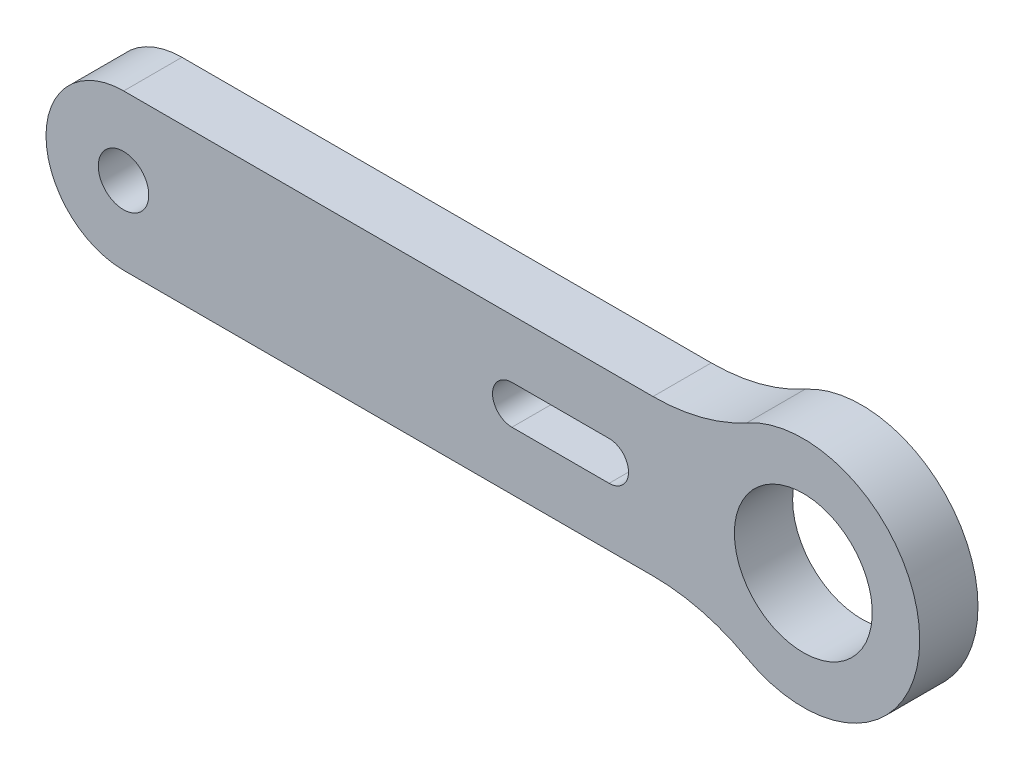
ISO-10303-21;
HEADER;
FILE_DESCRIPTION(('STEP AP214'),'2;1');
FILE_NAME('part.step','',(''),(''),'','','');
FILE_SCHEMA(('AUTOMOTIVE_DESIGN { 1 0 10303 214 1 1 1 1 }'));
ENDSEC;
DATA;
#1=APPLICATION_CONTEXT('core data for automotive mechanical design processes');
#2=APPLICATION_PROTOCOL_DEFINITION('international standard','automotive_design',2000,#1);
#3=PRODUCT_CONTEXT('',#1,'mechanical');
#4=PRODUCT('Part','Part','',(#3));
#5=PRODUCT_RELATED_PRODUCT_CATEGORY('part','',(#4));
#6=PRODUCT_DEFINITION_FORMATION('','',#4);
#7=PRODUCT_DEFINITION_CONTEXT('part definition',#1,'design');
#8=PRODUCT_DEFINITION('design','',#6,#7);
#9=PRODUCT_DEFINITION_SHAPE('','',#8);
#10=(LENGTH_UNIT() NAMED_UNIT(*) SI_UNIT(.MILLI.,.METRE.));
#11=(NAMED_UNIT(*) PLANE_ANGLE_UNIT() SI_UNIT($,.RADIAN.));
#12=(NAMED_UNIT(*) SI_UNIT($,.STERADIAN.) SOLID_ANGLE_UNIT());
#13=UNCERTAINTY_MEASURE_WITH_UNIT(LENGTH_MEASURE(1.E-05),#10,'distance_accuracy_value','');
#14=(GEOMETRIC_REPRESENTATION_CONTEXT(3) GLOBAL_UNCERTAINTY_ASSIGNED_CONTEXT((#13)) GLOBAL_UNIT_ASSIGNED_CONTEXT((#10,
#11,#12)) REPRESENTATION_CONTEXT('',''));
#15=CARTESIAN_POINT('',(0.,0.,0.));
#16=DIRECTION('',(0.,0.,1.));
#17=DIRECTION('',(1.,0.,0.));
#18=AXIS2_PLACEMENT_3D('',#15,#16,#17);
#19=CARTESIAN_POINT('',(23.3783422515076,4.00149259352111,0.));
#20=DIRECTION('',(0.,0.,1.));
#21=DIRECTION('',(1.,0.,0.));
#22=AXIS2_PLACEMENT_3D('',#19,#20,#21);
#23=CYLINDRICAL_SURFACE('',#22,5.99460570350379);
#24=CARTESIAN_POINT('',(23.3783422515076,4.00149259352111,3.));
#25=DIRECTION('',(0.,0.,1.));
#26=DIRECTION('',(1.,0.,0.));
#27=AXIS2_PLACEMENT_3D('',#24,#25,#26);
#28=CIRCLE('',#27,5.99460570350379);
#29=CARTESIAN_POINT('',(20.4804285975604,-1.24611581362462,3.));
#30=VERTEX_POINT('',#29);
#31=CARTESIAN_POINT('',(20.4784035436222,9.24798218476098,3.));
#32=VERTEX_POINT('',#31);
#33=EDGE_CURVE('E160',#30,#32,#28,.T.);
#34=ORIENTED_EDGE('',*,*,#33,.F.);
#35=DIRECTION('',(0.,0.,1.));
#36=VECTOR('',#35,1.);
#37=CARTESIAN_POINT('',(20.4804285975604,-1.24611581362462,0.));
#38=LINE('',#37,#36);
#39=CARTESIAN_POINT('',(20.4804285975604,-1.24611581362462,0.));
#40=VERTEX_POINT('',#39);
#41=EDGE_CURVE('E11',#40,#30,#38,.T.);
#42=ORIENTED_EDGE('',*,*,#41,.F.);
#43=CARTESIAN_POINT('',(23.3783422515076,4.00149259352111,0.));
#44=DIRECTION('',(0.,0.,1.));
#45=DIRECTION('',(1.,0.,0.));
#46=AXIS2_PLACEMENT_3D('',#43,#44,#45);
#47=CIRCLE('',#46,5.99460570350379);
#48=CARTESIAN_POINT('',(20.4784035436222,9.24798218476098,0.));
#49=VERTEX_POINT('',#48);
#50=EDGE_CURVE('E163',#40,#49,#47,.T.);
#51=ORIENTED_EDGE('',*,*,#50,.T.);
#52=DIRECTION('',(0.,0.,1.));
#53=VECTOR('',#52,1.);
#54=CARTESIAN_POINT('',(20.4784035436222,9.24798218476098,0.));
#55=LINE('',#54,#53);
#56=EDGE_CURVE('E40',#49,#32,#55,.T.);
#57=ORIENTED_EDGE('',*,*,#56,.T.);
#58=EDGE_LOOP('',(#34,#42,#51,#57));
#59=FACE_BOUND('',#58,.T.);
#60=ADVANCED_FACE('F37',(#59),#23,.T.);
#61=CARTESIAN_POINT('',(15.6462263209147,-10.,0.));
#62=DIRECTION('',(0.,0.,1.));
#63=DIRECTION('',(1.,0.,0.));
#64=AXIS2_PLACEMENT_3D('',#61,#62,#63);
#65=CYLINDRICAL_SURFACE('',#64,9.99999999999999);
#66=CARTESIAN_POINT('',(15.6462263209147,-10.,3.));
#67=DIRECTION('',(0.,0.,-1.));
#68=DIRECTION('',(-1.,0.,0.));
#69=AXIS2_PLACEMENT_3D('',#66,#67,#68);
#70=CIRCLE('',#69,9.99999999999999);
#71=CARTESIAN_POINT('',(15.6462263209147,0.,3.));
#72=VERTEX_POINT('',#71);
#73=EDGE_CURVE('E167',#72,#30,#70,.T.);
#74=ORIENTED_EDGE('',*,*,#73,.F.);
#75=DIRECTION('',(0.,0.,1.));
#76=VECTOR('',#75,1.);
#77=CARTESIAN_POINT('',(15.6462263209147,0.,0.));
#78=LINE('',#77,#76);
#79=CARTESIAN_POINT('',(15.6462263209147,0.,0.));
#80=VERTEX_POINT('',#79);
#81=EDGE_CURVE('E45',#80,#72,#78,.T.);
#82=ORIENTED_EDGE('',*,*,#81,.F.);
#83=CARTESIAN_POINT('',(15.6462263209147,-10.,0.));
#84=DIRECTION('',(0.,0.,-1.));
#85=DIRECTION('',(-1.,0.,0.));
#86=AXIS2_PLACEMENT_3D('',#83,#84,#85);
#87=CIRCLE('',#86,9.99999999999999);
#88=EDGE_CURVE('E179',#80,#40,#87,.T.);
#89=ORIENTED_EDGE('',*,*,#88,.T.);
#90=ORIENTED_EDGE('',*,*,#41,.T.);
#91=EDGE_LOOP('',(#74,#82,#89,#90));
#92=FACE_BOUND('',#91,.T.);
#93=ADVANCED_FACE('F216',(#92),#65,.F.);
#94=CARTESIAN_POINT('',(-11.6110208815812,0.,0.));
#95=DIRECTION('',(0.,-1.,0.));
#96=DIRECTION('',(0.,0.,-1.));
#97=AXIS2_PLACEMENT_3D('',#94,#95,#96);
#98=PLANE('',#97);
#99=DIRECTION('',(1.,0.,0.));
#100=VECTOR('',#99,1.);
#101=CARTESIAN_POINT('',(-11.6110208815812,0.,3.));
#102=LINE('',#101,#100);
#103=CARTESIAN_POINT('',(-11.6110208815812,0.,3.));
#104=VERTEX_POINT('',#103);
#105=EDGE_CURVE('E193',#104,#72,#102,.T.);
#106=ORIENTED_EDGE('',*,*,#105,.F.);
#107=DIRECTION('',(0.,0.,1.));
#108=VECTOR('',#107,1.);
#109=CARTESIAN_POINT('',(-11.6110208815812,0.,0.));
#110=LINE('',#109,#108);
#111=CARTESIAN_POINT('',(-11.6110208815812,0.,0.));
#112=VERTEX_POINT('',#111);
#113=EDGE_CURVE('E199',#112,#104,#110,.T.);
#114=ORIENTED_EDGE('',*,*,#113,.F.);
#115=DIRECTION('',(1.,0.,0.));
#116=VECTOR('',#115,1.);
#117=CARTESIAN_POINT('',(-11.6110208815812,0.,0.));
#118=LINE('',#117,#116);
#119=EDGE_CURVE('E176',#112,#80,#118,.T.);
#120=ORIENTED_EDGE('',*,*,#119,.T.);
#121=ORIENTED_EDGE('',*,*,#81,.T.);
#122=EDGE_LOOP('',(#106,#114,#120,#121));
#123=FACE_BOUND('',#122,.T.);
#124=ADVANCED_FACE('F228',(#123),#98,.T.);
#125=CARTESIAN_POINT('',(-11.6110208815812,4.,0.));
#126=DIRECTION('',(0.,0.,1.));
#127=DIRECTION('',(1.,0.,0.));
#128=AXIS2_PLACEMENT_3D('',#125,#126,#127);
#129=CYLINDRICAL_SURFACE('',#128,4.);
#130=CARTESIAN_POINT('',(-11.6110208815812,4.,3.));
#131=DIRECTION('',(0.,0.,1.));
#132=DIRECTION('',(1.,0.,0.));
#133=AXIS2_PLACEMENT_3D('',#130,#131,#132);
#134=CIRCLE('',#133,4.);
#135=CARTESIAN_POINT('',(-11.6110208815812,8.,3.));
#136=VERTEX_POINT('',#135);
#137=EDGE_CURVE('E190',#136,#104,#134,.T.);
#138=ORIENTED_EDGE('',*,*,#137,.F.);
#139=DIRECTION('',(0.,0.,1.));
#140=VECTOR('',#139,1.);
#141=CARTESIAN_POINT('',(-11.6110208815812,8.,0.));
#142=LINE('',#141,#140);
#143=CARTESIAN_POINT('',(-11.6110208815812,8.,0.));
#144=VERTEX_POINT('',#143);
#145=EDGE_CURVE('E201',#144,#136,#142,.T.);
#146=ORIENTED_EDGE('',*,*,#145,.F.);
#147=CARTESIAN_POINT('',(-11.6110208815812,4.,0.));
#148=DIRECTION('',(0.,0.,1.));
#149=DIRECTION('',(1.,0.,0.));
#150=AXIS2_PLACEMENT_3D('',#147,#148,#149);
#151=CIRCLE('',#150,4.);
#152=EDGE_CURVE('E173',#144,#112,#151,.T.);
#153=ORIENTED_EDGE('',*,*,#152,.T.);
#154=ORIENTED_EDGE('',*,*,#113,.T.);
#155=EDGE_LOOP('',(#138,#146,#153,#154));
#156=FACE_BOUND('',#155,.T.);
#157=ADVANCED_FACE('F226',(#156),#129,.T.);
#158=CARTESIAN_POINT('',(15.6408231399763,8.,0.));
#159=DIRECTION('',(0.,1.,0.));
#160=DIRECTION('',(0.,0.,1.));
#161=AXIS2_PLACEMENT_3D('',#158,#159,#160);
#162=PLANE('',#161);
#163=DIRECTION('',(-1.,0.,0.));
#164=VECTOR('',#163,1.);
#165=CARTESIAN_POINT('',(15.6408231399763,8.,3.));
#166=LINE('',#165,#164);
#167=CARTESIAN_POINT('',(15.6408231399763,8.,3.));
#168=VERTEX_POINT('',#167);
#169=EDGE_CURVE('E187',#168,#136,#166,.T.);
#170=ORIENTED_EDGE('',*,*,#169,.F.);
#171=DIRECTION('',(0.,0.,1.));
#172=VECTOR('',#171,1.);
#173=CARTESIAN_POINT('',(15.6408231399763,8.,0.));
#174=LINE('',#173,#172);
#175=CARTESIAN_POINT('',(15.6408231399763,8.,0.));
#176=VERTEX_POINT('',#175);
#177=EDGE_CURVE('E202',#176,#168,#174,.T.);
#178=ORIENTED_EDGE('',*,*,#177,.F.);
#179=DIRECTION('',(-1.,0.,0.));
#180=VECTOR('',#179,1.);
#181=CARTESIAN_POINT('',(15.6408231399763,8.,0.));
#182=LINE('',#181,#180);
#183=EDGE_CURVE('E170',#176,#144,#182,.T.);
#184=ORIENTED_EDGE('',*,*,#183,.T.);
#185=ORIENTED_EDGE('',*,*,#145,.T.);
#186=EDGE_LOOP('',(#170,#178,#184,#185));
#187=FACE_BOUND('',#186,.T.);
#188=ADVANCED_FACE('F223',(#187),#162,.T.);
#189=CARTESIAN_POINT('',(15.6408231399763,18.,0.));
#190=DIRECTION('',(0.,0.,1.));
#191=DIRECTION('',(1.,0.,0.));
#192=AXIS2_PLACEMENT_3D('',#189,#190,#191);
#193=CYLINDRICAL_SURFACE('',#192,10.);
#194=CARTESIAN_POINT('',(15.6408231399763,18.,3.));
#195=DIRECTION('',(0.,0.,-1.));
#196=DIRECTION('',(-1.,0.,0.));
#197=AXIS2_PLACEMENT_3D('',#194,#195,#196);
#198=CIRCLE('',#197,10.);
#199=EDGE_CURVE('E184',#32,#168,#198,.T.);
#200=ORIENTED_EDGE('',*,*,#199,.F.);
#201=ORIENTED_EDGE('',*,*,#56,.F.);
#202=CARTESIAN_POINT('',(15.6408231399763,18.,0.));
#203=DIRECTION('',(0.,0.,-1.));
#204=DIRECTION('',(-1.,0.,0.));
#205=AXIS2_PLACEMENT_3D('',#202,#203,#204);
#206=CIRCLE('',#205,10.);
#207=EDGE_CURVE('E166',#49,#176,#206,.T.);
#208=ORIENTED_EDGE('',*,*,#207,.T.);
#209=ORIENTED_EDGE('',*,*,#177,.T.);
#210=EDGE_LOOP('',(#200,#201,#208,#209));
#211=FACE_BOUND('',#210,.T.);
#212=ADVANCED_FACE('F210',(#211),#193,.F.);
#213=CARTESIAN_POINT('',(23.3783422515076,4.00149259352111,0.));
#214=DIRECTION('',(0.,0.,1.));
#215=DIRECTION('',(1.,0.,0.));
#216=AXIS2_PLACEMENT_3D('',#213,#214,#215);
#217=PLANE('',#216);
#218=DIRECTION('',(1.,0.,0.));
#219=VECTOR('',#218,1.);
#220=CARTESIAN_POINT('',(13.3803806473393,3.00053324889611,0.));
#221=LINE('',#220,#219);
#222=CARTESIAN_POINT('',(8.37884739844319,3.0005332488961,0.));
#223=VERTEX_POINT('',#222);
#224=CARTESIAN_POINT('',(13.3803806473393,3.00053324889611,0.));
#225=VERTEX_POINT('',#224);
#226=EDGE_CURVE('E122',#223,#225,#221,.T.);
#227=ORIENTED_EDGE('',*,*,#226,.T.);
#228=CARTESIAN_POINT('',(13.3803806473393,4.00026662444805,0.));
#229=DIRECTION('',(0.,0.,1.));
#230=DIRECTION('',(-1.,0.,0.));
#231=AXIS2_PLACEMENT_3D('',#228,#229,#230);
#232=CIRCLE('',#231,0.999733375551945);
#233=CARTESIAN_POINT('',(13.3803806473393,5.,0.));
#234=VERTEX_POINT('',#233);
#235=EDGE_CURVE('E116',#225,#234,#232,.T.);
#236=ORIENTED_EDGE('',*,*,#235,.T.);
#237=DIRECTION('',(-1.,0.,0.));
#238=VECTOR('',#237,1.);
#239=CARTESIAN_POINT('',(8.37884739844319,5.,0.));
#240=LINE('',#239,#238);
#241=CARTESIAN_POINT('',(8.37884739844319,5.,0.));
#242=VERTEX_POINT('',#241);
#243=EDGE_CURVE('E125',#234,#242,#240,.T.);
#244=ORIENTED_EDGE('',*,*,#243,.T.);
#245=CARTESIAN_POINT('',(8.37884739844319,4.00026662444805,0.));
#246=DIRECTION('',(0.,0.,1.));
#247=DIRECTION('',(-1.,0.,0.));
#248=AXIS2_PLACEMENT_3D('',#245,#246,#247);
#249=CIRCLE('',#248,0.999733375551946);
#250=EDGE_CURVE('E53',#242,#223,#249,.T.);
#251=ORIENTED_EDGE('',*,*,#250,.T.);
#252=EDGE_LOOP('',(#227,#236,#244,#251));
#253=FACE_BOUND('',#252,.T.);
#254=CARTESIAN_POINT('',(23.3793348450287,4.00050000000005,0.));
#255=DIRECTION('',(0.,0.,1.));
#256=DIRECTION('',(-1.,0.,0.));
#257=AXIS2_PLACEMENT_3D('',#254,#255,#256);
#258=CIRCLE('',#257,3.55);
#259=CARTESIAN_POINT('',(19.8293348450287,4.00050000000005,0.));
#260=VERTEX_POINT('',#259);
#261=EDGE_CURVE('E151',#260,#260,#258,.T.);
#262=ORIENTED_EDGE('',*,*,#261,.T.);
#263=EDGE_LOOP('',(#262));
#264=FACE_BOUND('',#263,.T.);
#265=CARTESIAN_POINT('',(-11.6193859771087,4.00018272906783,0.));
#266=DIRECTION('',(0.,0.,1.));
#267=DIRECTION('',(-1.,0.,0.));
#268=AXIS2_PLACEMENT_3D('',#265,#266,#267);
#269=CIRCLE('',#268,1.3);
#270=CARTESIAN_POINT('',(-12.9193859771087,4.00018272906783,0.));
#271=VERTEX_POINT('',#270);
#272=EDGE_CURVE('E157',#271,#271,#269,.T.);
#273=ORIENTED_EDGE('',*,*,#272,.T.);
#274=EDGE_LOOP('',(#273));
#275=FACE_BOUND('',#274,.T.);
#276=ORIENTED_EDGE('',*,*,#50,.F.);
#277=ORIENTED_EDGE('',*,*,#88,.F.);
#278=ORIENTED_EDGE('',*,*,#119,.F.);
#279=ORIENTED_EDGE('',*,*,#152,.F.);
#280=ORIENTED_EDGE('',*,*,#183,.F.);
#281=ORIENTED_EDGE('',*,*,#207,.F.);
#282=EDGE_LOOP('',(#276,#277,#278,#279,#280,#281));
#283=FACE_BOUND('',#282,.T.);
#284=ADVANCED_FACE('F129',(#253,#264,#275,#283),#217,.F.);
#285=CARTESIAN_POINT('',(23.3783422515076,4.00149259352111,3.));
#286=DIRECTION('',(0.,0.,1.));
#287=DIRECTION('',(1.,0.,0.));
#288=AXIS2_PLACEMENT_3D('',#285,#286,#287);
#289=PLANE('',#288);
#290=CARTESIAN_POINT('',(13.3803806473393,4.00026662444805,3.));
#291=DIRECTION('',(0.,0.,1.));
#292=DIRECTION('',(-1.,0.,0.));
#293=AXIS2_PLACEMENT_3D('',#290,#291,#292);
#294=CIRCLE('',#293,0.999733375551945);
#295=CARTESIAN_POINT('',(13.3803806473393,3.00053324889611,3.));
#296=VERTEX_POINT('',#295);
#297=CARTESIAN_POINT('',(13.3803806473393,5.,3.));
#298=VERTEX_POINT('',#297);
#299=EDGE_CURVE('E61',#296,#298,#294,.T.);
#300=ORIENTED_EDGE('',*,*,#299,.F.);
#301=DIRECTION('',(1.,0.,0.));
#302=VECTOR('',#301,1.);
#303=CARTESIAN_POINT('',(13.3803806473393,3.00053324889611,3.));
#304=LINE('',#303,#302);
#305=CARTESIAN_POINT('',(8.37884739844319,3.0005332488961,3.));
#306=VERTEX_POINT('',#305);
#307=EDGE_CURVE('E132',#306,#296,#304,.T.);
#308=ORIENTED_EDGE('',*,*,#307,.F.);
#309=CARTESIAN_POINT('',(8.37884739844319,4.00026662444805,3.));
#310=DIRECTION('',(0.,0.,1.));
#311=DIRECTION('',(-1.,0.,0.));
#312=AXIS2_PLACEMENT_3D('',#309,#310,#311);
#313=CIRCLE('',#312,0.999733375551946);
#314=CARTESIAN_POINT('',(8.37884739844319,5.,3.));
#315=VERTEX_POINT('',#314);
#316=EDGE_CURVE('E135',#315,#306,#313,.T.);
#317=ORIENTED_EDGE('',*,*,#316,.F.);
#318=DIRECTION('',(-1.,0.,0.));
#319=VECTOR('',#318,1.);
#320=CARTESIAN_POINT('',(8.37884739844319,5.,3.));
#321=LINE('',#320,#319);
#322=EDGE_CURVE('E141',#298,#315,#321,.T.);
#323=ORIENTED_EDGE('',*,*,#322,.F.);
#324=EDGE_LOOP('',(#300,#308,#317,#323));
#325=FACE_BOUND('',#324,.T.);
#326=CARTESIAN_POINT('',(23.3793348450287,4.00050000000005,3.));
#327=DIRECTION('',(0.,0.,1.));
#328=DIRECTION('',(-1.,0.,0.));
#329=AXIS2_PLACEMENT_3D('',#326,#327,#328);
#330=CIRCLE('',#329,3.55);
#331=CARTESIAN_POINT('',(19.8293348450287,4.00050000000005,3.));
#332=VERTEX_POINT('',#331);
#333=EDGE_CURVE('E147',#332,#332,#330,.T.);
#334=ORIENTED_EDGE('',*,*,#333,.F.);
#335=EDGE_LOOP('',(#334));
#336=FACE_BOUND('',#335,.T.);
#337=CARTESIAN_POINT('',(-11.6193859771087,4.00018272906783,3.));
#338=DIRECTION('',(0.,0.,1.));
#339=DIRECTION('',(-1.,0.,0.));
#340=AXIS2_PLACEMENT_3D('',#337,#338,#339);
#341=CIRCLE('',#340,1.3);
#342=CARTESIAN_POINT('',(-12.9193859771087,4.00018272906783,3.));
#343=VERTEX_POINT('',#342);
#344=EDGE_CURVE('E154',#343,#343,#341,.T.);
#345=ORIENTED_EDGE('',*,*,#344,.F.);
#346=EDGE_LOOP('',(#345));
#347=FACE_BOUND('',#346,.T.);
#348=ORIENTED_EDGE('',*,*,#33,.T.);
#349=ORIENTED_EDGE('',*,*,#199,.T.);
#350=ORIENTED_EDGE('',*,*,#169,.T.);
#351=ORIENTED_EDGE('',*,*,#137,.T.);
#352=ORIENTED_EDGE('',*,*,#105,.T.);
#353=ORIENTED_EDGE('',*,*,#73,.T.);
#354=EDGE_LOOP('',(#348,#349,#350,#351,#352,#353));
#355=FACE_BOUND('',#354,.T.);
#356=ADVANCED_FACE('F212',(#325,#336,#347,#355),#289,.T.);
#357=CARTESIAN_POINT('',(-11.6193859771087,4.00018272906783,0.));
#358=DIRECTION('',(0.,0.,1.));
#359=DIRECTION('',(1.,0.,0.));
#360=AXIS2_PLACEMENT_3D('',#357,#358,#359);
#361=CYLINDRICAL_SURFACE('',#360,1.3);
#362=ORIENTED_EDGE('',*,*,#272,.F.);
#363=EDGE_LOOP('',(#362));
#364=FACE_BOUND('',#363,.T.);
#365=ORIENTED_EDGE('',*,*,#344,.T.);
#366=EDGE_LOOP('',(#365));
#367=FACE_BOUND('',#366,.T.);
#368=ADVANCED_FACE('F286',(#364,#367),#361,.F.);
#369=CARTESIAN_POINT('',(23.3793348450287,4.00050000000005,0.));
#370=DIRECTION('',(0.,0.,1.));
#371=DIRECTION('',(1.,0.,0.));
#372=AXIS2_PLACEMENT_3D('',#369,#370,#371);
#373=CYLINDRICAL_SURFACE('',#372,3.55);
#374=ORIENTED_EDGE('',*,*,#261,.F.);
#375=EDGE_LOOP('',(#374));
#376=FACE_BOUND('',#375,.T.);
#377=ORIENTED_EDGE('',*,*,#333,.T.);
#378=EDGE_LOOP('',(#377));
#379=FACE_BOUND('',#378,.T.);
#380=ADVANCED_FACE('F296',(#376,#379),#373,.F.);
#381=CARTESIAN_POINT('',(13.3803806473393,4.00026662444805,0.));
#382=DIRECTION('',(0.,0.,1.));
#383=DIRECTION('',(1.,0.,0.));
#384=AXIS2_PLACEMENT_3D('',#381,#382,#383);
#385=CYLINDRICAL_SURFACE('',#384,0.999733375551945);
#386=ORIENTED_EDGE('',*,*,#299,.T.);
#387=DIRECTION('',(0.,0.,1.));
#388=VECTOR('',#387,1.);
#389=CARTESIAN_POINT('',(13.3803806473393,5.,0.));
#390=LINE('',#389,#388);
#391=EDGE_CURVE('E112',#234,#298,#390,.T.);
#392=ORIENTED_EDGE('',*,*,#391,.F.);
#393=ORIENTED_EDGE('',*,*,#235,.F.);
#394=DIRECTION('',(0.,0.,1.));
#395=VECTOR('',#394,1.);
#396=CARTESIAN_POINT('',(13.3803806473393,3.00053324889611,0.));
#397=LINE('',#396,#395);
#398=EDGE_CURVE('E145',#225,#296,#397,.T.);
#399=ORIENTED_EDGE('',*,*,#398,.T.);
#400=EDGE_LOOP('',(#386,#392,#393,#399));
#401=FACE_BOUND('',#400,.T.);
#402=ADVANCED_FACE('F114',(#401),#385,.F.);
#403=CARTESIAN_POINT('',(13.3803806473393,3.00053324889611,0.));
#404=DIRECTION('',(0.,-1.,0.));
#405=DIRECTION('',(1.,0.,0.));
#406=AXIS2_PLACEMENT_3D('',#403,#404,#405);
#407=PLANE('',#406);
#408=ORIENTED_EDGE('',*,*,#307,.T.);
#409=ORIENTED_EDGE('',*,*,#398,.F.);
#410=ORIENTED_EDGE('',*,*,#226,.F.);
#411=DIRECTION('',(0.,0.,1.));
#412=VECTOR('',#411,1.);
#413=CARTESIAN_POINT('',(8.37884739844319,3.0005332488961,0.));
#414=LINE('',#413,#412);
#415=EDGE_CURVE('E148',#223,#306,#414,.T.);
#416=ORIENTED_EDGE('',*,*,#415,.T.);
#417=EDGE_LOOP('',(#408,#409,#410,#416));
#418=FACE_BOUND('',#417,.T.);
#419=ADVANCED_FACE('F315',(#418),#407,.F.);
#420=CARTESIAN_POINT('',(8.37884739844319,4.00026662444805,0.));
#421=DIRECTION('',(0.,0.,1.));
#422=DIRECTION('',(1.,0.,0.));
#423=AXIS2_PLACEMENT_3D('',#420,#421,#422);
#424=CYLINDRICAL_SURFACE('',#423,0.999733375551946);
#425=ORIENTED_EDGE('',*,*,#316,.T.);
#426=ORIENTED_EDGE('',*,*,#415,.F.);
#427=ORIENTED_EDGE('',*,*,#250,.F.);
#428=DIRECTION('',(0.,0.,1.));
#429=VECTOR('',#428,1.);
#430=CARTESIAN_POINT('',(8.37884739844319,5.,0.));
#431=LINE('',#430,#429);
#432=EDGE_CURVE('E121',#242,#315,#431,.T.);
#433=ORIENTED_EDGE('',*,*,#432,.T.);
#434=EDGE_LOOP('',(#425,#426,#427,#433));
#435=FACE_BOUND('',#434,.T.);
#436=ADVANCED_FACE('F324',(#435),#424,.F.);
#437=CARTESIAN_POINT('',(8.37884739844319,5.,0.));
#438=DIRECTION('',(0.,1.,0.));
#439=DIRECTION('',(0.,0.,1.));
#440=AXIS2_PLACEMENT_3D('',#437,#438,#439);
#441=PLANE('',#440);
#442=ORIENTED_EDGE('',*,*,#322,.T.);
#443=ORIENTED_EDGE('',*,*,#432,.F.);
#444=ORIENTED_EDGE('',*,*,#243,.F.);
#445=ORIENTED_EDGE('',*,*,#391,.T.);
#446=EDGE_LOOP('',(#442,#443,#444,#445));
#447=FACE_BOUND('',#446,.T.);
#448=ADVANCED_FACE('F126',(#447),#441,.F.);
#449=CLOSED_SHELL('',(#60,#93,#124,#157,#188,#212,#284,#356,#368,#380,#402,#419,#436,#448));
#450=MANIFOLD_SOLID_BREP('B2',#449);
#451=ADVANCED_BREP_SHAPE_REPRESENTATION('',(#18,#450),#14);
#452=SHAPE_DEFINITION_REPRESENTATION(#9,#451);
ENDSEC;
END-ISO-10303-21;
